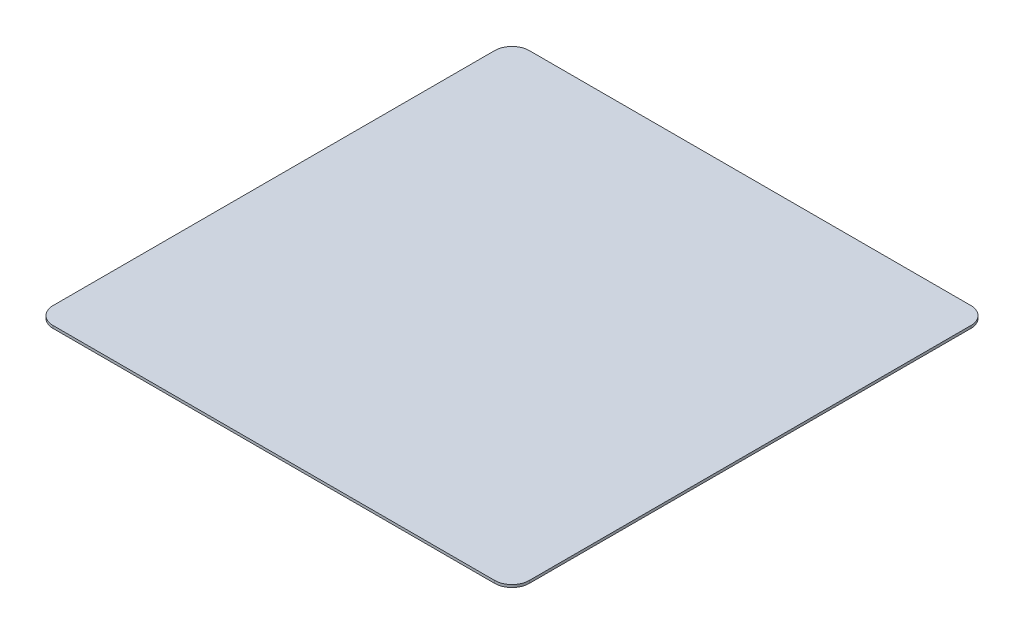
ISO-10303-21;
HEADER;
FILE_DESCRIPTION(('STEP AP214'),'2;1');
FILE_NAME('part.step','',(''),(''),'','','');
FILE_SCHEMA(('AUTOMOTIVE_DESIGN { 1 0 10303 214 1 1 1 1 }'));
ENDSEC;
DATA;
#1=APPLICATION_CONTEXT('core data for automotive mechanical design processes');
#2=APPLICATION_PROTOCOL_DEFINITION('international standard','automotive_design',2000,#1);
#3=PRODUCT_CONTEXT('',#1,'mechanical');
#4=PRODUCT('Part','Part','',(#3));
#5=PRODUCT_RELATED_PRODUCT_CATEGORY('part','',(#4));
#6=PRODUCT_DEFINITION_FORMATION('','',#4);
#7=PRODUCT_DEFINITION_CONTEXT('part definition',#1,'design');
#8=PRODUCT_DEFINITION('design','',#6,#7);
#9=PRODUCT_DEFINITION_SHAPE('','',#8);
#10=(LENGTH_UNIT() NAMED_UNIT(*) SI_UNIT(.MILLI.,.METRE.));
#11=(NAMED_UNIT(*) PLANE_ANGLE_UNIT() SI_UNIT($,.RADIAN.));
#12=(NAMED_UNIT(*) SI_UNIT($,.STERADIAN.) SOLID_ANGLE_UNIT());
#13=UNCERTAINTY_MEASURE_WITH_UNIT(LENGTH_MEASURE(1.E-05),#10,'distance_accuracy_value','');
#14=(GEOMETRIC_REPRESENTATION_CONTEXT(3) GLOBAL_UNCERTAINTY_ASSIGNED_CONTEXT((#13)) GLOBAL_UNIT_ASSIGNED_CONTEXT((#10,
#11,#12)) REPRESENTATION_CONTEXT('',''));
#15=CARTESIAN_POINT('',(0.,0.,0.));
#16=DIRECTION('',(0.,0.,1.));
#17=DIRECTION('',(1.,0.,0.));
#18=AXIS2_PLACEMENT_3D('',#15,#16,#17);
#19=CARTESIAN_POINT('',(-255.,3.,255.));
#20=DIRECTION('',(0.,-1.,0.));
#21=DIRECTION('',(0.,0.,-1.));
#22=AXIS2_PLACEMENT_3D('',#19,#20,#21);
#23=CYLINDRICAL_SURFACE('',#22,20.);
#24=CARTESIAN_POINT('',(-255.,0.,255.));
#25=DIRECTION('',(0.,1.,0.));
#26=DIRECTION('',(0.,0.,-1.));
#27=AXIS2_PLACEMENT_3D('',#24,#25,#26);
#28=CIRCLE('',#27,20.);
#29=CARTESIAN_POINT('',(-275.,0.,255.));
#30=VERTEX_POINT('',#29);
#31=CARTESIAN_POINT('',(-255.,0.,275.));
#32=VERTEX_POINT('',#31);
#33=EDGE_CURVE('E139',#30,#32,#28,.T.);
#34=ORIENTED_EDGE('',*,*,#33,.T.);
#35=DIRECTION('',(0.,-1.,0.));
#36=VECTOR('',#35,1.);
#37=CARTESIAN_POINT('',(-255.,3.,275.));
#38=LINE('',#37,#36);
#39=CARTESIAN_POINT('',(-255.,3.,275.));
#40=VERTEX_POINT('',#39);
#41=EDGE_CURVE('E11',#40,#32,#38,.T.);
#42=ORIENTED_EDGE('',*,*,#41,.F.);
#43=CARTESIAN_POINT('',(-255.,3.,255.));
#44=DIRECTION('',(0.,1.,0.));
#45=DIRECTION('',(0.,0.,-1.));
#46=AXIS2_PLACEMENT_3D('',#43,#44,#45);
#47=CIRCLE('',#46,20.);
#48=CARTESIAN_POINT('',(-275.,3.,255.));
#49=VERTEX_POINT('',#48);
#50=EDGE_CURVE('E153',#49,#40,#47,.T.);
#51=ORIENTED_EDGE('',*,*,#50,.F.);
#52=DIRECTION('',(0.,-1.,0.));
#53=VECTOR('',#52,1.);
#54=CARTESIAN_POINT('',(-275.,3.,255.));
#55=LINE('',#54,#53);
#56=EDGE_CURVE('E135',#49,#30,#55,.T.);
#57=ORIENTED_EDGE('',*,*,#56,.T.);
#58=EDGE_LOOP('',(#34,#42,#51,#57));
#59=FACE_BOUND('',#58,.T.);
#60=ADVANCED_FACE('F43',(#59),#23,.T.);
#61=CARTESIAN_POINT('',(-255.,3.,275.));
#62=DIRECTION('',(0.,0.,-1.));
#63=DIRECTION('',(-1.,0.,0.));
#64=AXIS2_PLACEMENT_3D('',#61,#62,#63);
#65=PLANE('',#64);
#66=DIRECTION('',(1.,0.,0.));
#67=VECTOR('',#66,1.);
#68=CARTESIAN_POINT('',(-255.,0.,275.));
#69=LINE('',#68,#67);
#70=CARTESIAN_POINT('',(255.,0.,275.));
#71=VERTEX_POINT('',#70);
#72=EDGE_CURVE('E142',#32,#71,#69,.T.);
#73=ORIENTED_EDGE('',*,*,#72,.T.);
#74=DIRECTION('',(0.,-1.,0.));
#75=VECTOR('',#74,1.);
#76=CARTESIAN_POINT('',(255.,3.,275.));
#77=LINE('',#76,#75);
#78=CARTESIAN_POINT('',(255.,3.,275.));
#79=VERTEX_POINT('',#78);
#80=EDGE_CURVE('E51',#79,#71,#77,.T.);
#81=ORIENTED_EDGE('',*,*,#80,.F.);
#82=DIRECTION('',(1.,0.,0.));
#83=VECTOR('',#82,1.);
#84=CARTESIAN_POINT('',(-255.,3.,275.));
#85=LINE('',#84,#83);
#86=EDGE_CURVE('E102',#40,#79,#85,.T.);
#87=ORIENTED_EDGE('',*,*,#86,.F.);
#88=ORIENTED_EDGE('',*,*,#41,.T.);
#89=EDGE_LOOP('',(#73,#81,#87,#88));
#90=FACE_BOUND('',#89,.T.);
#91=ADVANCED_FACE('F188',(#90),#65,.F.);
#92=CARTESIAN_POINT('',(255.,3.,255.));
#93=DIRECTION('',(0.,-1.,0.));
#94=DIRECTION('',(0.,0.,-1.));
#95=AXIS2_PLACEMENT_3D('',#92,#93,#94);
#96=CYLINDRICAL_SURFACE('',#95,20.);
#97=CARTESIAN_POINT('',(255.,0.,255.));
#98=DIRECTION('',(0.,1.,0.));
#99=DIRECTION('',(0.,0.,1.));
#100=AXIS2_PLACEMENT_3D('',#97,#98,#99);
#101=CIRCLE('',#100,20.);
#102=CARTESIAN_POINT('',(275.,0.,255.));
#103=VERTEX_POINT('',#102);
#104=EDGE_CURVE('E144',#71,#103,#101,.T.);
#105=ORIENTED_EDGE('',*,*,#104,.T.);
#106=DIRECTION('',(0.,-1.,0.));
#107=VECTOR('',#106,1.);
#108=CARTESIAN_POINT('',(275.,3.,255.));
#109=LINE('',#108,#107);
#110=CARTESIAN_POINT('',(275.,3.,255.));
#111=VERTEX_POINT('',#110);
#112=EDGE_CURVE('E160',#111,#103,#109,.T.);
#113=ORIENTED_EDGE('',*,*,#112,.F.);
#114=CARTESIAN_POINT('',(255.,3.,255.));
#115=DIRECTION('',(0.,1.,0.));
#116=DIRECTION('',(0.,0.,1.));
#117=AXIS2_PLACEMENT_3D('',#114,#115,#116);
#118=CIRCLE('',#117,20.);
#119=EDGE_CURVE('E168',#79,#111,#118,.T.);
#120=ORIENTED_EDGE('',*,*,#119,.F.);
#121=ORIENTED_EDGE('',*,*,#80,.T.);
#122=EDGE_LOOP('',(#105,#113,#120,#121));
#123=FACE_BOUND('',#122,.T.);
#124=ADVANCED_FACE('F166',(#123),#96,.T.);
#125=CARTESIAN_POINT('',(275.,3.,-255.));
#126=DIRECTION('',(-1.,0.,0.));
#127=DIRECTION('',(0.,0.,1.));
#128=AXIS2_PLACEMENT_3D('',#125,#126,#127);
#129=PLANE('',#128);
#130=DIRECTION('',(0.,0.,-1.));
#131=VECTOR('',#130,1.);
#132=CARTESIAN_POINT('',(275.,0.,-255.));
#133=LINE('',#132,#131);
#134=CARTESIAN_POINT('',(275.,0.,-255.));
#135=VERTEX_POINT('',#134);
#136=EDGE_CURVE('E146',#103,#135,#133,.T.);
#137=ORIENTED_EDGE('',*,*,#136,.T.);
#138=DIRECTION('',(0.,-1.,0.));
#139=VECTOR('',#138,1.);
#140=CARTESIAN_POINT('',(275.,3.,-255.));
#141=LINE('',#140,#139);
#142=CARTESIAN_POINT('',(275.,3.,-255.));
#143=VERTEX_POINT('',#142);
#144=EDGE_CURVE('E157',#143,#135,#141,.T.);
#145=ORIENTED_EDGE('',*,*,#144,.F.);
#146=DIRECTION('',(0.,0.,-1.));
#147=VECTOR('',#146,1.);
#148=CARTESIAN_POINT('',(275.,3.,-255.));
#149=LINE('',#148,#147);
#150=EDGE_CURVE('E180',#111,#143,#149,.T.);
#151=ORIENTED_EDGE('',*,*,#150,.F.);
#152=ORIENTED_EDGE('',*,*,#112,.T.);
#153=EDGE_LOOP('',(#137,#145,#151,#152));
#154=FACE_BOUND('',#153,.T.);
#155=ADVANCED_FACE('F176',(#154),#129,.F.);
#156=CARTESIAN_POINT('',(255.,3.,-255.));
#157=DIRECTION('',(0.,-1.,0.));
#158=DIRECTION('',(0.,0.,-1.));
#159=AXIS2_PLACEMENT_3D('',#156,#157,#158);
#160=CYLINDRICAL_SURFACE('',#159,20.);
#161=CARTESIAN_POINT('',(255.,0.,-255.));
#162=DIRECTION('',(0.,1.,0.));
#163=DIRECTION('',(0.,0.,1.));
#164=AXIS2_PLACEMENT_3D('',#161,#162,#163);
#165=CIRCLE('',#164,20.);
#166=CARTESIAN_POINT('',(255.,0.,-275.));
#167=VERTEX_POINT('',#166);
#168=EDGE_CURVE('E148',#135,#167,#165,.T.);
#169=ORIENTED_EDGE('',*,*,#168,.T.);
#170=DIRECTION('',(0.,-1.,0.));
#171=VECTOR('',#170,1.);
#172=CARTESIAN_POINT('',(255.,3.,-275.));
#173=LINE('',#172,#171);
#174=CARTESIAN_POINT('',(255.,3.,-275.));
#175=VERTEX_POINT('',#174);
#176=EDGE_CURVE('E130',#175,#167,#173,.T.);
#177=ORIENTED_EDGE('',*,*,#176,.F.);
#178=CARTESIAN_POINT('',(255.,3.,-255.));
#179=DIRECTION('',(0.,1.,0.));
#180=DIRECTION('',(0.,0.,1.));
#181=AXIS2_PLACEMENT_3D('',#178,#179,#180);
#182=CIRCLE('',#181,20.);
#183=EDGE_CURVE('E121',#143,#175,#182,.T.);
#184=ORIENTED_EDGE('',*,*,#183,.F.);
#185=ORIENTED_EDGE('',*,*,#144,.T.);
#186=EDGE_LOOP('',(#169,#177,#184,#185));
#187=FACE_BOUND('',#186,.T.);
#188=ADVANCED_FACE('F179',(#187),#160,.T.);
#189=CARTESIAN_POINT('',(-255.,3.,-275.));
#190=DIRECTION('',(0.,0.,1.));
#191=DIRECTION('',(1.,0.,0.));
#192=AXIS2_PLACEMENT_3D('',#189,#190,#191);
#193=PLANE('',#192);
#194=DIRECTION('',(-1.,0.,0.));
#195=VECTOR('',#194,1.);
#196=CARTESIAN_POINT('',(-255.,0.,-275.));
#197=LINE('',#196,#195);
#198=CARTESIAN_POINT('',(-255.,0.,-275.));
#199=VERTEX_POINT('',#198);
#200=EDGE_CURVE('E129',#167,#199,#197,.T.);
#201=ORIENTED_EDGE('',*,*,#200,.T.);
#202=DIRECTION('',(0.,-1.,0.));
#203=VECTOR('',#202,1.);
#204=CARTESIAN_POINT('',(-255.,3.,-275.));
#205=LINE('',#204,#203);
#206=CARTESIAN_POINT('',(-255.,3.,-275.));
#207=VERTEX_POINT('',#206);
#208=EDGE_CURVE('E126',#207,#199,#205,.T.);
#209=ORIENTED_EDGE('',*,*,#208,.F.);
#210=DIRECTION('',(-1.,0.,0.));
#211=VECTOR('',#210,1.);
#212=CARTESIAN_POINT('',(-255.,3.,-275.));
#213=LINE('',#212,#211);
#214=EDGE_CURVE('E115',#175,#207,#213,.T.);
#215=ORIENTED_EDGE('',*,*,#214,.F.);
#216=ORIENTED_EDGE('',*,*,#176,.T.);
#217=EDGE_LOOP('',(#201,#209,#215,#216));
#218=FACE_BOUND('',#217,.T.);
#219=ADVANCED_FACE('F127',(#218),#193,.F.);
#220=CARTESIAN_POINT('',(-255.,3.,-255.));
#221=DIRECTION('',(0.,-1.,0.));
#222=DIRECTION('',(0.,0.,-1.));
#223=AXIS2_PLACEMENT_3D('',#220,#221,#222);
#224=CYLINDRICAL_SURFACE('',#223,20.);
#225=CARTESIAN_POINT('',(-255.,0.,-255.));
#226=DIRECTION('',(0.,1.,0.));
#227=DIRECTION('',(0.,0.,1.));
#228=AXIS2_PLACEMENT_3D('',#225,#226,#227);
#229=CIRCLE('',#228,20.);
#230=CARTESIAN_POINT('',(-275.,0.,-255.));
#231=VERTEX_POINT('',#230);
#232=EDGE_CURVE('E88',#199,#231,#229,.T.);
#233=ORIENTED_EDGE('',*,*,#232,.T.);
#234=DIRECTION('',(0.,-1.,0.));
#235=VECTOR('',#234,1.);
#236=CARTESIAN_POINT('',(-275.,3.,-255.));
#237=LINE('',#236,#235);
#238=CARTESIAN_POINT('',(-275.,3.,-255.));
#239=VERTEX_POINT('',#238);
#240=EDGE_CURVE('E131',#239,#231,#237,.T.);
#241=ORIENTED_EDGE('',*,*,#240,.F.);
#242=CARTESIAN_POINT('',(-255.,3.,-255.));
#243=DIRECTION('',(0.,1.,0.));
#244=DIRECTION('',(0.,0.,1.));
#245=AXIS2_PLACEMENT_3D('',#242,#243,#244);
#246=CIRCLE('',#245,20.);
#247=EDGE_CURVE('E119',#207,#239,#246,.T.);
#248=ORIENTED_EDGE('',*,*,#247,.F.);
#249=ORIENTED_EDGE('',*,*,#208,.T.);
#250=EDGE_LOOP('',(#233,#241,#248,#249));
#251=FACE_BOUND('',#250,.T.);
#252=ADVANCED_FACE('F133',(#251),#224,.T.);
#253=CARTESIAN_POINT('',(-275.,3.,-255.));
#254=DIRECTION('',(1.,0.,0.));
#255=DIRECTION('',(0.,0.,-1.));
#256=AXIS2_PLACEMENT_3D('',#253,#254,#255);
#257=PLANE('',#256);
#258=DIRECTION('',(0.,0.,1.));
#259=VECTOR('',#258,1.);
#260=CARTESIAN_POINT('',(-275.,0.,-255.));
#261=LINE('',#260,#259);
#262=EDGE_CURVE('E94',#231,#30,#261,.T.);
#263=ORIENTED_EDGE('',*,*,#262,.T.);
#264=ORIENTED_EDGE('',*,*,#56,.F.);
#265=DIRECTION('',(0.,0.,1.));
#266=VECTOR('',#265,1.);
#267=CARTESIAN_POINT('',(-275.,3.,-255.));
#268=LINE('',#267,#266);
#269=EDGE_CURVE('E59',#239,#49,#268,.T.);
#270=ORIENTED_EDGE('',*,*,#269,.F.);
#271=ORIENTED_EDGE('',*,*,#240,.T.);
#272=EDGE_LOOP('',(#263,#264,#270,#271));
#273=FACE_BOUND('',#272,.T.);
#274=ADVANCED_FACE('F204',(#273),#257,.F.);
#275=CARTESIAN_POINT('',(-255.,3.,255.));
#276=DIRECTION('',(0.,-1.,0.));
#277=DIRECTION('',(0.,0.,-1.));
#278=AXIS2_PLACEMENT_3D('',#275,#276,#277);
#279=PLANE('',#278);
#280=ORIENTED_EDGE('',*,*,#50,.T.);
#281=ORIENTED_EDGE('',*,*,#86,.T.);
#282=ORIENTED_EDGE('',*,*,#119,.T.);
#283=ORIENTED_EDGE('',*,*,#150,.T.);
#284=ORIENTED_EDGE('',*,*,#183,.T.);
#285=ORIENTED_EDGE('',*,*,#214,.T.);
#286=ORIENTED_EDGE('',*,*,#247,.T.);
#287=ORIENTED_EDGE('',*,*,#269,.T.);
#288=EDGE_LOOP('',(#280,#281,#282,#283,#284,#285,#286,#287));
#289=FACE_BOUND('',#288,.T.);
#290=ADVANCED_FACE('F117',(#289),#279,.F.);
#291=CARTESIAN_POINT('',(-255.,0.,255.));
#292=DIRECTION('',(0.,-1.,0.));
#293=DIRECTION('',(0.,0.,-1.));
#294=AXIS2_PLACEMENT_3D('',#291,#292,#293);
#295=PLANE('',#294);
#296=ORIENTED_EDGE('',*,*,#33,.F.);
#297=ORIENTED_EDGE('',*,*,#262,.F.);
#298=ORIENTED_EDGE('',*,*,#232,.F.);
#299=ORIENTED_EDGE('',*,*,#200,.F.);
#300=ORIENTED_EDGE('',*,*,#168,.F.);
#301=ORIENTED_EDGE('',*,*,#136,.F.);
#302=ORIENTED_EDGE('',*,*,#104,.F.);
#303=ORIENTED_EDGE('',*,*,#72,.F.);
#304=EDGE_LOOP('',(#296,#297,#298,#299,#300,#301,#302,#303));
#305=FACE_BOUND('',#304,.T.);
#306=ADVANCED_FACE('F172',(#305),#295,.T.);
#307=CLOSED_SHELL('',(#60,#91,#124,#155,#188,#219,#252,#274,#290,#306));
#308=MANIFOLD_SOLID_BREP('B2',#307);
#309=ADVANCED_BREP_SHAPE_REPRESENTATION('',(#18,#308),#14);
#310=SHAPE_DEFINITION_REPRESENTATION(#9,#309);
ENDSEC;
END-ISO-10303-21;
